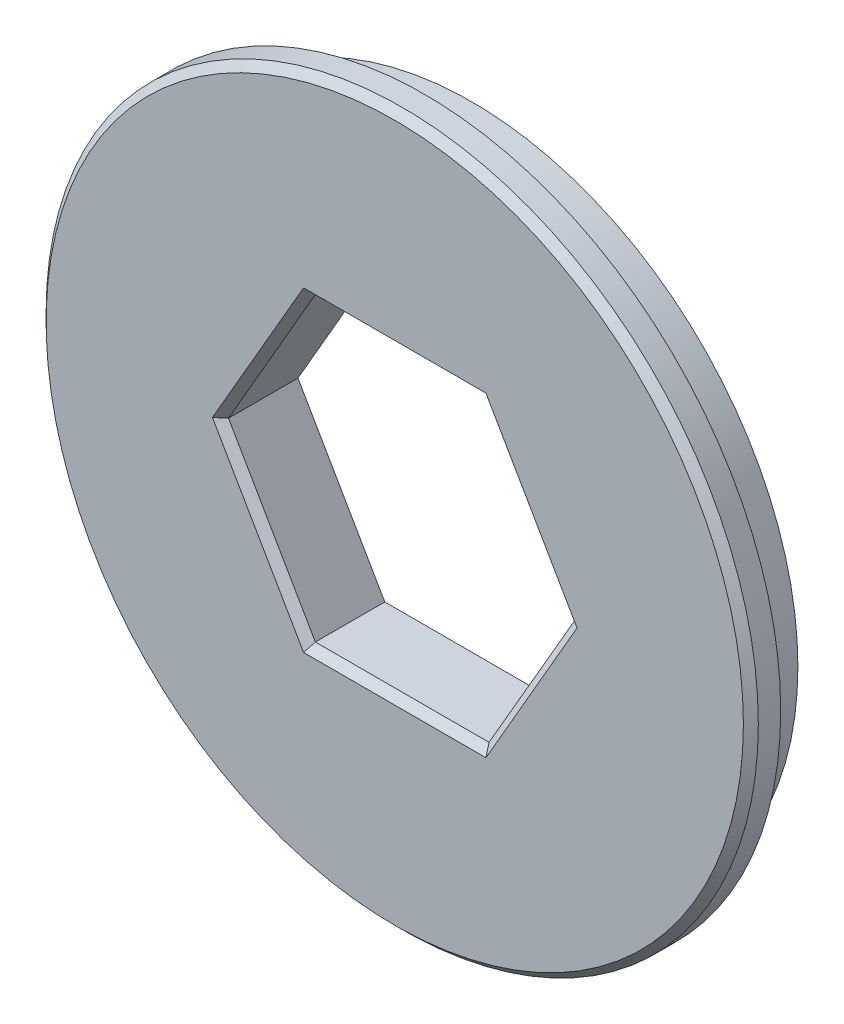
ISO-10303-21;
HEADER;
FILE_DESCRIPTION(('STEP AP214'),'2;1');
FILE_NAME('part.step','',(''),(''),'','','');
FILE_SCHEMA(('AUTOMOTIVE_DESIGN { 1 0 10303 214 1 1 1 1 }'));
ENDSEC;
DATA;
#1=APPLICATION_CONTEXT('core data for automotive mechanical design processes');
#2=APPLICATION_PROTOCOL_DEFINITION('international standard','automotive_design',2000,#1);
#3=PRODUCT_CONTEXT('',#1,'mechanical');
#4=PRODUCT('Part','Part','',(#3));
#5=PRODUCT_RELATED_PRODUCT_CATEGORY('part','',(#4));
#6=PRODUCT_DEFINITION_FORMATION('','',#4);
#7=PRODUCT_DEFINITION_CONTEXT('part definition',#1,'design');
#8=PRODUCT_DEFINITION('design','',#6,#7);
#9=PRODUCT_DEFINITION_SHAPE('','',#8);
#10=(LENGTH_UNIT() NAMED_UNIT(*) SI_UNIT(.MILLI.,.METRE.));
#11=(NAMED_UNIT(*) PLANE_ANGLE_UNIT() SI_UNIT($,.RADIAN.));
#12=(NAMED_UNIT(*) SI_UNIT($,.STERADIAN.) SOLID_ANGLE_UNIT());
#13=UNCERTAINTY_MEASURE_WITH_UNIT(LENGTH_MEASURE(1.E-05),#10,'distance_accuracy_value','');
#14=(GEOMETRIC_REPRESENTATION_CONTEXT(3) GLOBAL_UNCERTAINTY_ASSIGNED_CONTEXT((#13)) GLOBAL_UNIT_ASSIGNED_CONTEXT((#10,
#11,#12)) REPRESENTATION_CONTEXT('',''));
#15=CARTESIAN_POINT('',(0.,0.,0.));
#16=DIRECTION('',(0.,0.,1.));
#17=DIRECTION('',(1.,0.,0.));
#18=AXIS2_PLACEMENT_3D('',#15,#16,#17);
#19=CARTESIAN_POINT('',(0.,0.,4.9));
#20=DIRECTION('',(0.,0.,-1.));
#21=DIRECTION('',(-1.,0.,0.));
#22=AXIS2_PLACEMENT_3D('',#19,#20,#21);
#23=CONICAL_SURFACE('',#22,23.6,0.785398163397447);
#24=CARTESIAN_POINT('',(0.,0.,5.15));
#25=DIRECTION('',(0.,0.,-1.));
#26=DIRECTION('',(-1.,0.,0.));
#27=AXIS2_PLACEMENT_3D('',#24,#25,#26);
#28=CIRCLE('',#27,23.35);
#29=CARTESIAN_POINT('',(23.35,0.,5.15));
#30=VERTEX_POINT('',#29);
#31=EDGE_CURVE('E11',#30,#30,#28,.T.);
#32=ORIENTED_EDGE('',*,*,#31,.T.);
#33=DIRECTION('',(0.707106781186546,0.,-0.707106781186549));
#34=VECTOR('',#33,1.);
#35=CARTESIAN_POINT('',(23.6,0.,4.9));
#36=LINE('',#35,#34);
#37=CARTESIAN_POINT('',(23.85,0.,4.65));
#38=VERTEX_POINT('',#37);
#39=EDGE_CURVE('E27',#30,#38,#36,.T.);
#40=ORIENTED_EDGE('',*,*,#39,.T.);
#41=CARTESIAN_POINT('',(0.,0.,4.65));
#42=DIRECTION('',(0.,0.,1.));
#43=DIRECTION('',(-1.,0.,0.));
#44=AXIS2_PLACEMENT_3D('',#41,#42,#43);
#45=CIRCLE('',#44,23.85);
#46=CARTESIAN_POINT('',(-23.85,0.,4.65));
#47=VERTEX_POINT('',#46);
#48=EDGE_CURVE('E202',#38,#47,#45,.T.);
#49=ORIENTED_EDGE('',*,*,#48,.T.);
#50=CARTESIAN_POINT('',(0.,0.,4.65));
#51=DIRECTION('',(0.,0.,1.));
#52=DIRECTION('',(-1.,0.,0.));
#53=AXIS2_PLACEMENT_3D('',#50,#51,#52);
#54=CIRCLE('',#53,23.85);
#55=EDGE_CURVE('E199',#47,#38,#54,.T.);
#56=ORIENTED_EDGE('',*,*,#55,.T.);
#57=ORIENTED_EDGE('',*,*,#39,.F.);
#58=EDGE_LOOP('',(#32,#40,#49,#56,#57));
#59=FACE_BOUND('',#58,.T.);
#60=ADVANCED_FACE('F17',(#59),#23,.T.);
#61=CARTESIAN_POINT('',(0.,0.,5.15));
#62=DIRECTION('',(0.,0.,1.));
#63=DIRECTION('',(1.,0.,0.));
#64=AXIS2_PLACEMENT_3D('',#61,#62,#63);
#65=PLANE('',#64);
#66=ORIENTED_EDGE('',*,*,#31,.F.);
#67=EDGE_LOOP('',(#66));
#68=FACE_BOUND('',#67,.T.);
#69=DIRECTION('',(-1.,-1.25087052683702E-11,0.));
#70=VECTOR('',#69,1.);
#71=CARTESIAN_POINT('',(-2.90840198112724,10.5749999999985,5.15));
#72=LINE('',#71,#70);
#73=CARTESIAN_POINT('',(6.10547909651965,10.5750000001113,5.15));
#74=VERTEX_POINT('',#73);
#75=CARTESIAN_POINT('',(-6.10547909671531,10.5749999999585,5.15));
#76=VERTEX_POINT('',#75);
#77=EDGE_CURVE('E219',#74,#76,#72,.T.);
#78=ORIENTED_EDGE('',*,*,#77,.F.);
#79=DIRECTION('',(-0.500000000018534,0.866025403773738,0.));
#80=VECTOR('',#79,1.);
#81=CARTESIAN_POINT('',(7.70401765438454,7.80625000016827,5.15));
#82=LINE('',#81,#80);
#83=CARTESIAN_POINT('',(12.2109581933487,3.76250142153367E-10,5.15));
#84=VERTEX_POINT('',#83);
#85=EDGE_CURVE('E198',#84,#74,#82,.T.);
#86=ORIENTED_EDGE('',*,*,#85,.F.);
#87=DIRECTION('',(0.499999999981176,0.866025403795307,0.));
#88=VECTOR('',#87,1.);
#89=CARTESIAN_POINT('',(10.6124196355676,-2.76874999969744,5.15));
#90=LINE('',#89,#88);
#91=CARTESIAN_POINT('',(6.1054790968677,-10.5749999998094,5.15));
#92=VERTEX_POINT('',#91);
#93=EDGE_CURVE('E258',#92,#84,#90,.T.);
#94=ORIENTED_EDGE('',*,*,#93,.F.);
#95=DIRECTION('',(1.,2.50176014010538E-11,0.));
#96=VECTOR('',#95,1.);
#97=CARTESIAN_POINT('',(2.90840198126927,-10.5749999998894,5.15));
#98=LINE('',#97,#96);
#99=CARTESIAN_POINT('',(-6.1054790965972,-10.5750000001149,5.15));
#100=VERTEX_POINT('',#99);
#101=EDGE_CURVE('E274',#100,#92,#98,.T.);
#102=ORIENTED_EDGE('',*,*,#101,.F.);
#103=DIRECTION('',(0.500000000000665,-0.866025403784055,0.));
#104=VECTOR('',#103,1.);
#105=CARTESIAN_POINT('',(-7.70401765445336,-7.80625000005507,5.15));
#106=LINE('',#105,#104);
#107=CARTESIAN_POINT('',(-12.2109581933113,-7.50999262777441E-11,5.15));
#108=VERTEX_POINT('',#107);
#109=EDGE_CURVE('E247',#108,#100,#106,.T.);
#110=ORIENTED_EDGE('',*,*,#109,.F.);
#111=DIRECTION('',(-0.499999999993629,-0.866025403788117,0.));
#112=VECTOR('',#111,1.);
#113=CARTESIAN_POINT('',(-10.6124196355228,2.76874999991951,5.15));
#114=LINE('',#113,#112);
#115=EDGE_CURVE('E229',#76,#108,#114,.T.);
#116=ORIENTED_EDGE('',*,*,#115,.F.);
#117=EDGE_LOOP('',(#78,#86,#94,#102,#110,#116));
#118=FACE_BOUND('',#117,.T.);
#119=ADVANCED_FACE('F333',(#68,#118),#65,.T.);
#120=CARTESIAN_POINT('',(0.,0.,5.15));
#121=DIRECTION('',(0.,0.,-1.));
#122=DIRECTION('',(1.,0.,0.));
#123=AXIS2_PLACEMENT_3D('',#120,#121,#122);
#124=CYLINDRICAL_SURFACE('',#123,23.85);
#125=CARTESIAN_POINT('',(0.,0.,3.15));
#126=DIRECTION('',(0.,0.,-1.));
#127=DIRECTION('',(1.,0.,0.));
#128=AXIS2_PLACEMENT_3D('',#125,#126,#127);
#129=CIRCLE('',#128,23.85);
#130=CARTESIAN_POINT('',(23.85,0.,3.15));
#131=VERTEX_POINT('',#130);
#132=CARTESIAN_POINT('',(-23.85,0.,3.15));
#133=VERTEX_POINT('',#132);
#134=EDGE_CURVE('E164',#131,#133,#129,.T.);
#135=ORIENTED_EDGE('',*,*,#134,.F.);
#136=CARTESIAN_POINT('',(0.,0.,3.15));
#137=DIRECTION('',(0.,0.,-1.));
#138=DIRECTION('',(1.,0.,0.));
#139=AXIS2_PLACEMENT_3D('',#136,#137,#138);
#140=CIRCLE('',#139,23.85);
#141=EDGE_CURVE('E212',#133,#131,#140,.T.);
#142=ORIENTED_EDGE('',*,*,#141,.F.);
#143=DIRECTION('',(0.,0.,1.));
#144=VECTOR('',#143,1.);
#145=CARTESIAN_POINT('',(-23.85,0.,5.15));
#146=LINE('',#145,#144);
#147=EDGE_CURVE('E203',#133,#47,#146,.T.);
#148=ORIENTED_EDGE('',*,*,#147,.T.);
#149=ORIENTED_EDGE('',*,*,#48,.F.);
#150=ORIENTED_EDGE('',*,*,#55,.F.);
#151=ORIENTED_EDGE('',*,*,#147,.F.);
#152=EDGE_LOOP('',(#135,#142,#148,#149,#150,#151));
#153=FACE_BOUND('',#152,.T.);
#154=ADVANCED_FACE('F339',(#153),#124,.T.);
#155=CARTESIAN_POINT('',(-2.90840198112412,10.3249999999985,4.9));
#156=DIRECTION('',(8.84499031912846E-12,-0.707106781186547,0.707106781186548));
#157=DIRECTION('',(-1.,-1.25087052683702E-11,0.));
#158=AXIS2_PLACEMENT_3D('',#155,#156,#157);
#159=PLANE('',#158);
#160=ORIENTED_EDGE('',*,*,#77,.T.);
#161=DIRECTION('',(0.377964473015491,-0.654653670703806,-0.654653670708532));
#162=VECTOR('',#161,1.);
#163=CARTESIAN_POINT('',(-6.10547909671531,10.5749999999585,5.15));
#164=LINE('',#163,#162);
#165=CARTESIAN_POINT('',(-5.81680396211596,10.0749999999622,4.65));
#166=VERTEX_POINT('',#165);
#167=EDGE_CURVE('E228',#76,#166,#164,.T.);
#168=ORIENTED_EDGE('',*,*,#167,.T.);
#169=DIRECTION('',(1.,1.25087052683702E-11,0.));
#170=VECTOR('',#169,1.);
#171=CARTESIAN_POINT('',(-2.90840198112099,10.0749999999985,4.65));
#172=LINE('',#171,#170);
#173=CARTESIAN_POINT('',(5.81680396193406,10.0750000001077,4.65));
#174=VERTEX_POINT('',#173);
#175=EDGE_CURVE('E225',#166,#174,#172,.T.);
#176=ORIENTED_EDGE('',*,*,#175,.T.);
#177=DIRECTION('',(-0.377964472997712,-0.654653670713665,-0.654653670708937));
#178=VECTOR('',#177,1.);
#179=CARTESIAN_POINT('',(6.10547909651965,10.5750000001113,5.15));
#180=LINE('',#179,#178);
#181=EDGE_CURVE('E122',#74,#174,#180,.T.);
#182=ORIENTED_EDGE('',*,*,#181,.F.);
#183=EDGE_LOOP('',(#160,#168,#176,#182));
#184=FACE_BOUND('',#183,.T.);
#185=ADVANCED_FACE('F350',(#184),#159,.T.);
#186=CARTESIAN_POINT('',(-10.3959132845758,2.6437499999211,4.9));
#187=DIRECTION('',(0.612372435698394,-0.353553390588768,0.707106781186549));
#188=DIRECTION('',(-0.499999999993629,-0.866025403788117,0.));
#189=AXIS2_PLACEMENT_3D('',#186,#187,#188);
#190=PLANE('',#189);
#191=ORIENTED_EDGE('',*,*,#115,.T.);
#192=DIRECTION('',(0.75592894601784,3.06569123759064E-12,-0.654653670708687));
#193=VECTOR('',#192,1.);
#194=CARTESIAN_POINT('',(-12.2109581933113,-7.51010365007687E-11,5.15));
#195=LINE('',#194,#193);
#196=CARTESIAN_POINT('',(-11.6336079241228,-7.27595761418343E-11,4.65));
#197=VERTEX_POINT('',#196);
#198=EDGE_CURVE('E246',#108,#197,#195,.T.);
#199=ORIENTED_EDGE('',*,*,#198,.T.);
#200=DIRECTION('',(0.499999999993629,0.866025403788117,0.));
#201=VECTOR('',#200,1.);
#202=CARTESIAN_POINT('',(-10.1794069336287,2.5187499999227,4.65));
#203=LINE('',#202,#201);
#204=EDGE_CURVE('E133',#197,#166,#203,.T.);
#205=ORIENTED_EDGE('',*,*,#204,.T.);
#206=ORIENTED_EDGE('',*,*,#167,.F.);
#207=EDGE_LOOP('',(#191,#199,#205,#206));
#208=FACE_BOUND('',#207,.T.);
#209=ADVANCED_FACE('F357',(#208),#190,.T.);
#210=CARTESIAN_POINT('',(-7.48751130350735,-7.6812500000549,4.9));
#211=DIRECTION('',(0.612372435695523,0.353553390593743,0.707106781186548));
#212=DIRECTION('',(0.500000000000664,-0.866025403784055,0.));
#213=AXIS2_PLACEMENT_3D('',#210,#211,#212);
#214=PLANE('',#213);
#215=ORIENTED_EDGE('',*,*,#109,.T.);
#216=DIRECTION('',(0.37796447300192,0.654653670714816,-0.654653670705358));
#217=VECTOR('',#216,1.);
#218=CARTESIAN_POINT('',(-6.1054790965972,-10.5750000001149,5.15));
#219=LINE('',#218,#217);
#220=CARTESIAN_POINT('',(-5.81680396200682,-10.0750000001077,4.65));
#221=VERTEX_POINT('',#220);
#222=EDGE_CURVE('E251',#100,#221,#219,.T.);
#223=ORIENTED_EDGE('',*,*,#222,.T.);
#224=DIRECTION('',(-0.500000000000665,0.866025403784055,0.));
#225=VECTOR('',#224,1.);
#226=CARTESIAN_POINT('',(-7.27100495256133,-7.55625000005474,4.65));
#227=LINE('',#226,#225);
#228=EDGE_CURVE('E115',#221,#197,#227,.T.);
#229=ORIENTED_EDGE('',*,*,#228,.T.);
#230=ORIENTED_EDGE('',*,*,#198,.F.);
#231=EDGE_LOOP('',(#215,#223,#229,#230));
#232=FACE_BOUND('',#231,.T.);
#233=ADVANCED_FACE('F355',(#232),#214,.T.);
#234=CARTESIAN_POINT('',(2.90840198126302,-10.3249999998894,4.9));
#235=DIRECTION('',(-1.76901155997072E-11,0.707106781186547,0.707106781186548));
#236=DIRECTION('',(1.,2.50176014010538E-11,0.));
#237=AXIS2_PLACEMENT_3D('',#234,#235,#236);
#238=PLANE('',#237);
#239=ORIENTED_EDGE('',*,*,#101,.T.);
#240=DIRECTION('',(-0.377964473024376,0.654653670698877,-0.654653670708331));
#241=VECTOR('',#240,1.);
#242=CARTESIAN_POINT('',(6.1054790968677,-10.5749999998094,5.15));
#243=LINE('',#242,#241);
#244=CARTESIAN_POINT('',(5.81680396226147,-10.0749999998166,4.65));
#245=VERTEX_POINT('',#244);
#246=EDGE_CURVE('E278',#92,#245,#243,.T.);
#247=ORIENTED_EDGE('',*,*,#246,.T.);
#248=DIRECTION('',(-1.,-2.50176014010538E-11,0.));
#249=VECTOR('',#248,1.);
#250=CARTESIAN_POINT('',(2.90840198125676,-10.0749999998894,4.65));
#251=LINE('',#250,#249);
#252=EDGE_CURVE('E276',#245,#221,#251,.T.);
#253=ORIENTED_EDGE('',*,*,#252,.T.);
#254=ORIENTED_EDGE('',*,*,#222,.F.);
#255=EDGE_LOOP('',(#239,#247,#253,#254));
#256=FACE_BOUND('',#255,.T.);
#257=ADVANCED_FACE('F345',(#256),#238,.T.);
#258=CARTESIAN_POINT('',(10.3959132846188,-2.64374999970215,4.9));
#259=DIRECTION('',(-0.61237243570348,0.353553390579964,0.707106781186547));
#260=DIRECTION('',(0.499999999981177,0.866025403795307,0.));
#261=AXIS2_PLACEMENT_3D('',#258,#259,#260);
#262=PLANE('',#261);
#263=DIRECTION('',(-0.499999999981176,-0.866025403795307,0.));
#264=VECTOR('',#263,1.);
#265=CARTESIAN_POINT('',(10.17940693367,-2.51874999970685,4.65));
#266=LINE('',#265,#264);
#267=CARTESIAN_POINT('',(11.6336079241592,3.63797880709171E-10,4.65));
#268=VERTEX_POINT('',#267);
#269=EDGE_CURVE('E279',#268,#245,#266,.T.);
#270=ORIENTED_EDGE('',*,*,#269,.T.);
#271=ORIENTED_EDGE('',*,*,#246,.F.);
#272=ORIENTED_EDGE('',*,*,#93,.T.);
#273=DIRECTION('',(-0.755928946018423,-1.63038373261172E-11,-0.654653670708014));
#274=VECTOR('',#273,1.);
#275=CARTESIAN_POINT('',(12.2109581933487,3.76250142153367E-10,5.15));
#276=LINE('',#275,#274);
#277=EDGE_CURVE('E254',#84,#268,#276,.T.);
#278=ORIENTED_EDGE('',*,*,#277,.T.);
#279=EDGE_LOOP('',(#270,#271,#272,#278));
#280=FACE_BOUND('',#279,.T.);
#281=ADVANCED_FACE('F329',(#280),#262,.T.);
#282=CARTESIAN_POINT('',(7.4875113034411,7.68125000016363,4.9));
#283=DIRECTION('',(-0.612372435688228,-0.35355339060638,0.707106781186548));
#284=DIRECTION('',(-0.500000000018534,0.866025403773738,0.));
#285=AXIS2_PLACEMENT_3D('',#282,#283,#284);
#286=PLANE('',#285);
#287=DIRECTION('',(0.500000000018534,-0.866025403773738,0.));
#288=VECTOR('',#287,1.);
#289=CARTESIAN_POINT('',(7.27100495249767,7.556250000159,4.65));
#290=LINE('',#289,#288);
#291=EDGE_CURVE('E158',#174,#268,#290,.T.);
#292=ORIENTED_EDGE('',*,*,#291,.T.);
#293=ORIENTED_EDGE('',*,*,#277,.F.);
#294=ORIENTED_EDGE('',*,*,#85,.T.);
#295=ORIENTED_EDGE('',*,*,#181,.T.);
#296=EDGE_LOOP('',(#292,#293,#294,#295));
#297=FACE_BOUND('',#296,.T.);
#298=ADVANCED_FACE('F322',(#297),#286,.T.);
#299=CARTESIAN_POINT('',(11.6336079241592,3.63797880709171E-10,0.));
#300=DIRECTION('',(-0.866025403795307,0.499999999981176,0.));
#301=DIRECTION('',(0.,0.,1.));
#302=AXIS2_PLACEMENT_3D('',#299,#300,#301);
#303=PLANE('',#302);
#304=ORIENTED_EDGE('',*,*,#269,.F.);
#305=DIRECTION('',(0.,0.,1.));
#306=VECTOR('',#305,1.);
#307=CARTESIAN_POINT('',(11.6336079241592,3.63797880709171E-10,0.));
#308=LINE('',#307,#306);
#309=CARTESIAN_POINT('',(11.6336079241592,3.63797880709171E-10,0.));
#310=VERTEX_POINT('',#309);
#311=EDGE_CURVE('E177',#310,#268,#308,.T.);
#312=ORIENTED_EDGE('',*,*,#311,.F.);
#313=DIRECTION('',(-0.499999999981176,-0.866025403795307,0.));
#314=VECTOR('',#313,1.);
#315=CARTESIAN_POINT('',(11.6336079241592,3.63797880709171E-10,0.));
#316=LINE('',#315,#314);
#317=CARTESIAN_POINT('',(5.81680396226147,-10.0749999998166,0.));
#318=VERTEX_POINT('',#317);
#319=EDGE_CURVE('E174',#310,#318,#316,.T.);
#320=ORIENTED_EDGE('',*,*,#319,.T.);
#321=DIRECTION('',(0.,0.,1.));
#322=VECTOR('',#321,1.);
#323=CARTESIAN_POINT('',(5.81680396226147,-10.0749999998166,0.));
#324=LINE('',#323,#322);
#325=EDGE_CURVE('E176',#318,#245,#324,.T.);
#326=ORIENTED_EDGE('',*,*,#325,.T.);
#327=EDGE_LOOP('',(#304,#312,#320,#326));
#328=FACE_BOUND('',#327,.T.);
#329=ADVANCED_FACE('F320',(#328),#303,.T.);
#330=CARTESIAN_POINT('',(5.81680396193406,10.0750000001077,0.));
#331=DIRECTION('',(-0.866025403773738,-0.500000000018534,0.));
#332=DIRECTION('',(-0.500000000018534,0.866025403773738,0.));
#333=AXIS2_PLACEMENT_3D('',#330,#331,#332);
#334=PLANE('',#333);
#335=ORIENTED_EDGE('',*,*,#291,.F.);
#336=DIRECTION('',(0.,0.,1.));
#337=VECTOR('',#336,1.);
#338=CARTESIAN_POINT('',(5.81680396193406,10.0750000001077,0.));
#339=LINE('',#338,#337);
#340=CARTESIAN_POINT('',(5.81680396193406,10.0750000001077,0.));
#341=VERTEX_POINT('',#340);
#342=EDGE_CURVE('E153',#341,#174,#339,.T.);
#343=ORIENTED_EDGE('',*,*,#342,.F.);
#344=DIRECTION('',(0.500000000018534,-0.866025403773738,0.));
#345=VECTOR('',#344,1.);
#346=CARTESIAN_POINT('',(5.81680396193406,10.0750000001077,0.));
#347=LINE('',#346,#345);
#348=EDGE_CURVE('E157',#341,#310,#347,.T.);
#349=ORIENTED_EDGE('',*,*,#348,.T.);
#350=ORIENTED_EDGE('',*,*,#311,.T.);
#351=EDGE_LOOP('',(#335,#343,#349,#350));
#352=FACE_BOUND('',#351,.T.);
#353=ADVANCED_FACE('F155',(#352),#334,.T.);
#354=CARTESIAN_POINT('',(-5.81680396211596,10.0749999999622,0.));
#355=DIRECTION('',(1.25087052683702E-11,-1.,0.));
#356=DIRECTION('',(0.,0.,-1.));
#357=AXIS2_PLACEMENT_3D('',#354,#355,#356);
#358=PLANE('',#357);
#359=ORIENTED_EDGE('',*,*,#175,.F.);
#360=DIRECTION('',(0.,0.,1.));
#361=VECTOR('',#360,1.);
#362=CARTESIAN_POINT('',(-5.81680396211596,10.0749999999622,0.));
#363=LINE('',#362,#361);
#364=CARTESIAN_POINT('',(-5.81680396211596,10.0749999999622,0.));
#365=VERTEX_POINT('',#364);
#366=EDGE_CURVE('E181',#365,#166,#363,.T.);
#367=ORIENTED_EDGE('',*,*,#366,.F.);
#368=DIRECTION('',(1.,1.25087052683702E-11,0.));
#369=VECTOR('',#368,1.);
#370=CARTESIAN_POINT('',(-5.81680396211596,10.0749999999622,0.));
#371=LINE('',#370,#369);
#372=EDGE_CURVE('E163',#365,#341,#371,.T.);
#373=ORIENTED_EDGE('',*,*,#372,.T.);
#374=ORIENTED_EDGE('',*,*,#342,.T.);
#375=EDGE_LOOP('',(#359,#367,#373,#374));
#376=FACE_BOUND('',#375,.T.);
#377=ADVANCED_FACE('F179',(#376),#358,.T.);
#378=CARTESIAN_POINT('',(0.,0.,3.15));
#379=DIRECTION('',(0.,0.,1.));
#380=DIRECTION('',(1.,0.,0.));
#381=AXIS2_PLACEMENT_3D('',#378,#379,#380);
#382=PLANE('',#381);
#383=ORIENTED_EDGE('',*,*,#134,.T.);
#384=ORIENTED_EDGE('',*,*,#141,.T.);
#385=EDGE_LOOP('',(#383,#384));
#386=FACE_BOUND('',#385,.T.);
#387=CARTESIAN_POINT('',(0.,0.,3.15));
#388=DIRECTION('',(0.,0.,-1.));
#389=DIRECTION('',(1.,0.,0.));
#390=AXIS2_PLACEMENT_3D('',#387,#388,#389);
#391=CIRCLE('',#390,21.85);
#392=CARTESIAN_POINT('',(21.85,0.,3.15));
#393=VERTEX_POINT('',#392);
#394=CARTESIAN_POINT('',(-21.85,0.,3.15));
#395=VERTEX_POINT('',#394);
#396=EDGE_CURVE('E230',#393,#395,#391,.T.);
#397=ORIENTED_EDGE('',*,*,#396,.F.);
#398=CARTESIAN_POINT('',(0.,0.,3.15));
#399=DIRECTION('',(0.,0.,-1.));
#400=DIRECTION('',(1.,0.,0.));
#401=AXIS2_PLACEMENT_3D('',#398,#399,#400);
#402=CIRCLE('',#401,21.85);
#403=EDGE_CURVE('E192',#395,#393,#402,.T.);
#404=ORIENTED_EDGE('',*,*,#403,.F.);
#405=EDGE_LOOP('',(#397,#404));
#406=FACE_BOUND('',#405,.T.);
#407=ADVANCED_FACE('F361',(#386,#406),#382,.F.);
#408=CARTESIAN_POINT('',(-11.6336079241228,-7.27595761418343E-11,0.));
#409=DIRECTION('',(0.866025403788117,-0.499999999993629,0.));
#410=DIRECTION('',(0.,0.,-1.));
#411=AXIS2_PLACEMENT_3D('',#408,#409,#410);
#412=PLANE('',#411);
#413=ORIENTED_EDGE('',*,*,#204,.F.);
#414=DIRECTION('',(0.,0.,1.));
#415=VECTOR('',#414,1.);
#416=CARTESIAN_POINT('',(-11.6336079241228,-7.27595761418343E-11,0.));
#417=LINE('',#416,#415);
#418=CARTESIAN_POINT('',(-11.6336079241228,-7.27595761418343E-11,0.));
#419=VERTEX_POINT('',#418);
#420=EDGE_CURVE('E240',#419,#197,#417,.T.);
#421=ORIENTED_EDGE('',*,*,#420,.F.);
#422=DIRECTION('',(0.499999999993629,0.866025403788117,0.));
#423=VECTOR('',#422,1.);
#424=CARTESIAN_POINT('',(-11.6336079241228,-7.27595761418343E-11,0.));
#425=LINE('',#424,#423);
#426=EDGE_CURVE('E209',#419,#365,#425,.T.);
#427=ORIENTED_EDGE('',*,*,#426,.T.);
#428=ORIENTED_EDGE('',*,*,#366,.T.);
#429=EDGE_LOOP('',(#413,#421,#427,#428));
#430=FACE_BOUND('',#429,.T.);
#431=ADVANCED_FACE('F313',(#430),#412,.T.);
#432=CARTESIAN_POINT('',(-5.81680396200682,-10.0750000001077,0.));
#433=DIRECTION('',(0.866025403784055,0.500000000000665,0.));
#434=DIRECTION('',(0.,0.,-1.));
#435=AXIS2_PLACEMENT_3D('',#432,#433,#434);
#436=PLANE('',#435);
#437=ORIENTED_EDGE('',*,*,#228,.F.);
#438=DIRECTION('',(0.,0.,1.));
#439=VECTOR('',#438,1.);
#440=CARTESIAN_POINT('',(-5.81680396200682,-10.0750000001077,0.));
#441=LINE('',#440,#439);
#442=CARTESIAN_POINT('',(-5.81680396200682,-10.0750000001077,0.));
#443=VERTEX_POINT('',#442);
#444=EDGE_CURVE('E234',#443,#221,#441,.T.);
#445=ORIENTED_EDGE('',*,*,#444,.F.);
#446=DIRECTION('',(-0.500000000000665,0.866025403784055,0.));
#447=VECTOR('',#446,1.);
#448=CARTESIAN_POINT('',(-5.81680396200682,-10.0750000001077,0.));
#449=LINE('',#448,#447);
#450=EDGE_CURVE('E236',#443,#419,#449,.T.);
#451=ORIENTED_EDGE('',*,*,#450,.T.);
#452=ORIENTED_EDGE('',*,*,#420,.T.);
#453=EDGE_LOOP('',(#437,#445,#451,#452));
#454=FACE_BOUND('',#453,.T.);
#455=ADVANCED_FACE('F316',(#454),#436,.T.);
#456=CARTESIAN_POINT('',(5.81680396226147,-10.0749999998166,0.));
#457=DIRECTION('',(-2.50176014010538E-11,1.,0.));
#458=DIRECTION('',(1.,2.50176014010538E-11,0.));
#459=AXIS2_PLACEMENT_3D('',#456,#457,#458);
#460=PLANE('',#459);
#461=ORIENTED_EDGE('',*,*,#252,.F.);
#462=ORIENTED_EDGE('',*,*,#325,.F.);
#463=DIRECTION('',(-1.,-2.50176014010538E-11,0.));
#464=VECTOR('',#463,1.);
#465=CARTESIAN_POINT('',(5.81680396226147,-10.0749999998166,0.));
#466=LINE('',#465,#464);
#467=EDGE_CURVE('E262',#318,#443,#466,.T.);
#468=ORIENTED_EDGE('',*,*,#467,.T.);
#469=ORIENTED_EDGE('',*,*,#444,.T.);
#470=EDGE_LOOP('',(#461,#462,#468,#469));
#471=FACE_BOUND('',#470,.T.);
#472=ADVANCED_FACE('F318',(#471),#460,.T.);
#473=CARTESIAN_POINT('',(0.,0.,0.));
#474=DIRECTION('',(0.,0.,1.));
#475=DIRECTION('',(1.,0.,0.));
#476=AXIS2_PLACEMENT_3D('',#473,#474,#475);
#477=CYLINDRICAL_SURFACE('',#476,21.85);
#478=ORIENTED_EDGE('',*,*,#396,.T.);
#479=DIRECTION('',(0.,0.,-1.));
#480=VECTOR('',#479,1.);
#481=CARTESIAN_POINT('',(-21.85,0.,0.));
#482=LINE('',#481,#480);
#483=CARTESIAN_POINT('',(-21.85,0.,0.));
#484=VERTEX_POINT('',#483);
#485=EDGE_CURVE('E235',#395,#484,#482,.T.);
#486=ORIENTED_EDGE('',*,*,#485,.T.);
#487=CARTESIAN_POINT('',(0.,0.,0.));
#488=DIRECTION('',(0.,0.,1.));
#489=DIRECTION('',(1.,0.,0.));
#490=AXIS2_PLACEMENT_3D('',#487,#488,#489);
#491=CIRCLE('',#490,21.85);
#492=CARTESIAN_POINT('',(21.85,0.,0.));
#493=VERTEX_POINT('',#492);
#494=EDGE_CURVE('E208',#484,#493,#491,.T.);
#495=ORIENTED_EDGE('',*,*,#494,.T.);
#496=CARTESIAN_POINT('',(0.,0.,0.));
#497=DIRECTION('',(0.,0.,1.));
#498=DIRECTION('',(1.,0.,0.));
#499=AXIS2_PLACEMENT_3D('',#496,#497,#498);
#500=CIRCLE('',#499,21.85);
#501=EDGE_CURVE('E195',#493,#484,#500,.T.);
#502=ORIENTED_EDGE('',*,*,#501,.T.);
#503=ORIENTED_EDGE('',*,*,#485,.F.);
#504=ORIENTED_EDGE('',*,*,#403,.T.);
#505=EDGE_LOOP('',(#478,#486,#495,#502,#503,#504));
#506=FACE_BOUND('',#505,.T.);
#507=ADVANCED_FACE('F19',(#506),#477,.T.);
#508=CARTESIAN_POINT('',(0.,0.,0.));
#509=DIRECTION('',(0.,0.,1.));
#510=DIRECTION('',(1.,0.,0.));
#511=AXIS2_PLACEMENT_3D('',#508,#509,#510);
#512=PLANE('',#511);
#513=ORIENTED_EDGE('',*,*,#501,.F.);
#514=ORIENTED_EDGE('',*,*,#494,.F.);
#515=EDGE_LOOP('',(#513,#514));
#516=FACE_BOUND('',#515,.T.);
#517=ORIENTED_EDGE('',*,*,#372,.F.);
#518=ORIENTED_EDGE('',*,*,#426,.F.);
#519=ORIENTED_EDGE('',*,*,#450,.F.);
#520=ORIENTED_EDGE('',*,*,#467,.F.);
#521=ORIENTED_EDGE('',*,*,#319,.F.);
#522=ORIENTED_EDGE('',*,*,#348,.F.);
#523=EDGE_LOOP('',(#517,#518,#519,#520,#521,#522));
#524=FACE_BOUND('',#523,.T.);
#525=ADVANCED_FACE('F169',(#516,#524),#512,.F.);
#526=CLOSED_SHELL('',(#60,#119,#154,#185,#209,#233,#257,#281,#298,#329,#353,#377,#407,#431,#455,
#472,#507,#525));
#527=MANIFOLD_SOLID_BREP('B1',#526);
#528=ADVANCED_BREP_SHAPE_REPRESENTATION('',(#18,#527),#14);
#529=SHAPE_DEFINITION_REPRESENTATION(#9,#528);
ENDSEC;
END-ISO-10303-21;
